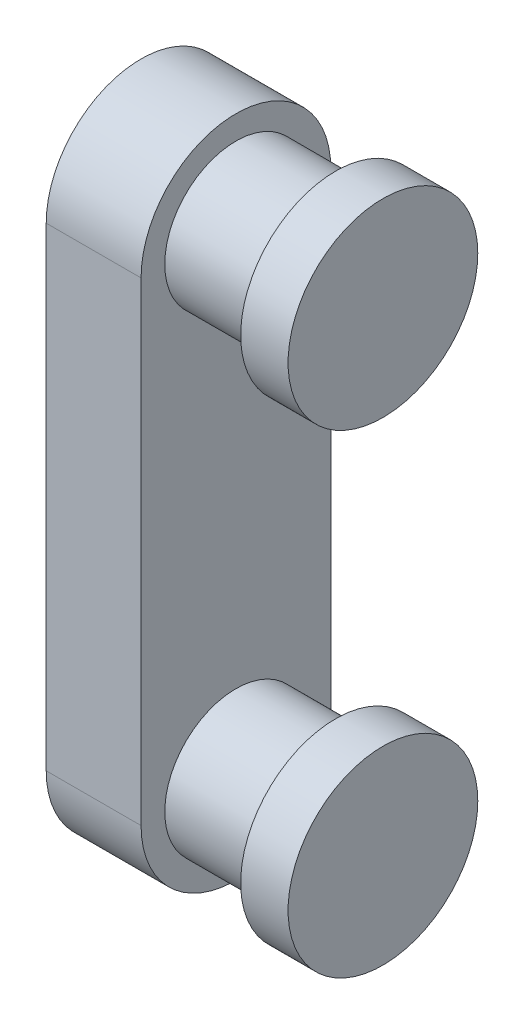
ISO-10303-21;
HEADER;
FILE_DESCRIPTION(('STEP AP214'),'2;1');
FILE_NAME('part.step','',(''),(''),'','','');
FILE_SCHEMA(('AUTOMOTIVE_DESIGN { 1 0 10303 214 1 1 1 1 }'));
ENDSEC;
DATA;
#1=APPLICATION_CONTEXT('core data for automotive mechanical design processes');
#2=APPLICATION_PROTOCOL_DEFINITION('international standard','automotive_design',2000,#1);
#3=PRODUCT_CONTEXT('',#1,'mechanical');
#4=PRODUCT('Part','Part','',(#3));
#5=PRODUCT_RELATED_PRODUCT_CATEGORY('part','',(#4));
#6=PRODUCT_DEFINITION_FORMATION('','',#4);
#7=PRODUCT_DEFINITION_CONTEXT('part definition',#1,'design');
#8=PRODUCT_DEFINITION('design','',#6,#7);
#9=PRODUCT_DEFINITION_SHAPE('','',#8);
#10=(LENGTH_UNIT() NAMED_UNIT(*) SI_UNIT(.MILLI.,.METRE.));
#11=(NAMED_UNIT(*) PLANE_ANGLE_UNIT() SI_UNIT($,.RADIAN.));
#12=(NAMED_UNIT(*) SI_UNIT($,.STERADIAN.) SOLID_ANGLE_UNIT());
#13=UNCERTAINTY_MEASURE_WITH_UNIT(LENGTH_MEASURE(1.E-05),#10,'distance_accuracy_value','');
#14=(GEOMETRIC_REPRESENTATION_CONTEXT(3) GLOBAL_UNCERTAINTY_ASSIGNED_CONTEXT((#13)) GLOBAL_UNIT_ASSIGNED_CONTEXT((#10,
#11,#12)) REPRESENTATION_CONTEXT('',''));
#15=CARTESIAN_POINT('',(0.,0.,0.));
#16=DIRECTION('',(0.,0.,1.));
#17=DIRECTION('',(1.,0.,0.));
#18=AXIS2_PLACEMENT_3D('',#15,#16,#17);
#19=CARTESIAN_POINT('',(2.,-5.,0.));
#20=DIRECTION('',(-1.,0.,0.));
#21=DIRECTION('',(0.,0.,1.));
#22=AXIS2_PLACEMENT_3D('',#19,#20,#21);
#23=PLANE('',#22);
#24=CARTESIAN_POINT('',(2.,-5.,0.));
#25=DIRECTION('',(-1.,0.,0.));
#26=DIRECTION('',(0.,0.,-1.));
#27=AXIS2_PLACEMENT_3D('',#24,#25,#26);
#28=CIRCLE('',#27,1.5);
#29=CARTESIAN_POINT('',(2.,-5.,-1.5));
#30=VERTEX_POINT('',#29);
#31=EDGE_CURVE('E167',#30,#30,#28,.T.);
#32=ORIENTED_EDGE('',*,*,#31,.T.);
#33=EDGE_LOOP('',(#32));
#34=FACE_BOUND('',#33,.T.);
#35=CARTESIAN_POINT('',(2.,-5.,0.));
#36=DIRECTION('',(1.,0.,0.));
#37=DIRECTION('',(0.,0.,1.));
#38=AXIS2_PLACEMENT_3D('',#35,#36,#37);
#39=CIRCLE('',#38,2.);
#40=CARTESIAN_POINT('',(2.,-5.,2.));
#41=VERTEX_POINT('',#40);
#42=CARTESIAN_POINT('',(2.,-5.,-2.));
#43=VERTEX_POINT('',#42);
#44=EDGE_CURVE('E86',#41,#43,#39,.T.);
#45=ORIENTED_EDGE('',*,*,#44,.T.);
#46=DIRECTION('',(0.,1.,0.));
#47=VECTOR('',#46,1.);
#48=CARTESIAN_POINT('',(2.,5.,-2.));
#49=LINE('',#48,#47);
#50=CARTESIAN_POINT('',(2.,5.,-2.));
#51=VERTEX_POINT('',#50);
#52=EDGE_CURVE('E81',#43,#51,#49,.T.);
#53=ORIENTED_EDGE('',*,*,#52,.T.);
#54=CARTESIAN_POINT('',(2.,5.,0.));
#55=DIRECTION('',(1.,0.,0.));
#56=DIRECTION('',(0.,0.,-1.));
#57=AXIS2_PLACEMENT_3D('',#54,#55,#56);
#58=CIRCLE('',#57,2.);
#59=CARTESIAN_POINT('',(2.,4.99999999999999,2.));
#60=VERTEX_POINT('',#59);
#61=EDGE_CURVE('E84',#51,#60,#58,.T.);
#62=ORIENTED_EDGE('',*,*,#61,.T.);
#63=DIRECTION('',(0.,-1.,0.));
#64=VECTOR('',#63,1.);
#65=CARTESIAN_POINT('',(2.,4.99999999999999,2.));
#66=LINE('',#65,#64);
#67=EDGE_CURVE('E50',#60,#41,#66,.T.);
#68=ORIENTED_EDGE('',*,*,#67,.T.);
#69=EDGE_LOOP('',(#45,#53,#62,#68));
#70=FACE_BOUND('',#69,.T.);
#71=CARTESIAN_POINT('',(2.,5.,0.));
#72=DIRECTION('',(-1.,0.,0.));
#73=DIRECTION('',(0.,0.,1.));
#74=AXIS2_PLACEMENT_3D('',#71,#72,#73);
#75=CIRCLE('',#74,1.5);
#76=CARTESIAN_POINT('',(2.,5.,1.5));
#77=VERTEX_POINT('',#76);
#78=EDGE_CURVE('E11',#77,#77,#75,.F.);
#79=ORIENTED_EDGE('',*,*,#78,.F.);
#80=EDGE_LOOP('',(#79));
#81=FACE_BOUND('',#80,.T.);
#82=ADVANCED_FACE('F33',(#34,#70,#81),#23,.F.);
#83=CARTESIAN_POINT('',(2.,-5.,0.));
#84=DIRECTION('',(-1.,0.,0.));
#85=DIRECTION('',(0.,0.,1.));
#86=AXIS2_PLACEMENT_3D('',#83,#84,#85);
#87=CYLINDRICAL_SURFACE('',#86,2.);
#88=CARTESIAN_POINT('',(0.,-5.,0.));
#89=DIRECTION('',(1.,0.,0.));
#90=DIRECTION('',(0.,0.,1.));
#91=AXIS2_PLACEMENT_3D('',#88,#89,#90);
#92=CIRCLE('',#91,2.);
#93=CARTESIAN_POINT('',(0.,-5.,2.));
#94=VERTEX_POINT('',#93);
#95=CARTESIAN_POINT('',(0.,-5.,-2.));
#96=VERTEX_POINT('',#95);
#97=EDGE_CURVE('E100',#94,#96,#92,.T.);
#98=ORIENTED_EDGE('',*,*,#97,.T.);
#99=DIRECTION('',(-1.,0.,0.));
#100=VECTOR('',#99,1.);
#101=CARTESIAN_POINT('',(2.,-5.,-2.));
#102=LINE('',#101,#100);
#103=EDGE_CURVE('E42',#43,#96,#102,.T.);
#104=ORIENTED_EDGE('',*,*,#103,.F.);
#105=ORIENTED_EDGE('',*,*,#44,.F.);
#106=DIRECTION('',(-1.,0.,0.));
#107=VECTOR('',#106,1.);
#108=CARTESIAN_POINT('',(2.,-5.,2.));
#109=LINE('',#108,#107);
#110=EDGE_CURVE('E96',#41,#94,#109,.T.);
#111=ORIENTED_EDGE('',*,*,#110,.T.);
#112=EDGE_LOOP('',(#98,#104,#105,#111));
#113=FACE_BOUND('',#112,.T.);
#114=ADVANCED_FACE('F35',(#113),#87,.T.);
#115=CARTESIAN_POINT('',(2.,5.,-2.));
#116=DIRECTION('',(0.,0.,1.));
#117=DIRECTION('',(0.,-1.,0.));
#118=AXIS2_PLACEMENT_3D('',#115,#116,#117);
#119=PLANE('',#118);
#120=DIRECTION('',(0.,1.,0.));
#121=VECTOR('',#120,1.);
#122=CARTESIAN_POINT('',(0.,5.,-2.));
#123=LINE('',#122,#121);
#124=CARTESIAN_POINT('',(0.,5.,-2.));
#125=VERTEX_POINT('',#124);
#126=EDGE_CURVE('E91',#96,#125,#123,.T.);
#127=ORIENTED_EDGE('',*,*,#126,.T.);
#128=DIRECTION('',(-1.,0.,0.));
#129=VECTOR('',#128,1.);
#130=CARTESIAN_POINT('',(2.,5.,-2.));
#131=LINE('',#130,#129);
#132=EDGE_CURVE('E89',#51,#125,#131,.T.);
#133=ORIENTED_EDGE('',*,*,#132,.F.);
#134=ORIENTED_EDGE('',*,*,#52,.F.);
#135=ORIENTED_EDGE('',*,*,#103,.T.);
#136=EDGE_LOOP('',(#127,#133,#134,#135));
#137=FACE_BOUND('',#136,.T.);
#138=ADVANCED_FACE('F90',(#137),#119,.F.);
#139=CARTESIAN_POINT('',(2.,5.,0.));
#140=DIRECTION('',(-1.,0.,0.));
#141=DIRECTION('',(0.,0.,1.));
#142=AXIS2_PLACEMENT_3D('',#139,#140,#141);
#143=CYLINDRICAL_SURFACE('',#142,2.);
#144=CARTESIAN_POINT('',(0.,5.,0.));
#145=DIRECTION('',(1.,0.,0.));
#146=DIRECTION('',(0.,0.,-1.));
#147=AXIS2_PLACEMENT_3D('',#144,#145,#146);
#148=CIRCLE('',#147,2.);
#149=CARTESIAN_POINT('',(0.,4.99999999999999,2.));
#150=VERTEX_POINT('',#149);
#151=EDGE_CURVE('E67',#125,#150,#148,.T.);
#152=ORIENTED_EDGE('',*,*,#151,.T.);
#153=DIRECTION('',(-1.,0.,0.));
#154=VECTOR('',#153,1.);
#155=CARTESIAN_POINT('',(2.,4.99999999999999,2.));
#156=LINE('',#155,#154);
#157=EDGE_CURVE('E92',#60,#150,#156,.T.);
#158=ORIENTED_EDGE('',*,*,#157,.F.);
#159=ORIENTED_EDGE('',*,*,#61,.F.);
#160=ORIENTED_EDGE('',*,*,#132,.T.);
#161=EDGE_LOOP('',(#152,#158,#159,#160));
#162=FACE_BOUND('',#161,.T.);
#163=ADVANCED_FACE('F94',(#162),#143,.T.);
#164=CARTESIAN_POINT('',(2.,4.99999999999999,2.));
#165=DIRECTION('',(0.,0.,-1.));
#166=DIRECTION('',(0.,1.,0.));
#167=AXIS2_PLACEMENT_3D('',#164,#165,#166);
#168=PLANE('',#167);
#169=DIRECTION('',(0.,-1.,0.));
#170=VECTOR('',#169,1.);
#171=CARTESIAN_POINT('',(0.,4.99999999999999,2.));
#172=LINE('',#171,#170);
#173=EDGE_CURVE('E73',#150,#94,#172,.T.);
#174=ORIENTED_EDGE('',*,*,#173,.T.);
#175=ORIENTED_EDGE('',*,*,#110,.F.);
#176=ORIENTED_EDGE('',*,*,#67,.F.);
#177=ORIENTED_EDGE('',*,*,#157,.T.);
#178=EDGE_LOOP('',(#174,#175,#176,#177));
#179=FACE_BOUND('',#178,.T.);
#180=ADVANCED_FACE('F114',(#179),#168,.F.);
#181=CARTESIAN_POINT('',(0.,-5.,0.));
#182=DIRECTION('',(-1.,0.,0.));
#183=DIRECTION('',(0.,0.,1.));
#184=AXIS2_PLACEMENT_3D('',#181,#182,#183);
#185=PLANE('',#184);
#186=ORIENTED_EDGE('',*,*,#97,.F.);
#187=ORIENTED_EDGE('',*,*,#173,.F.);
#188=ORIENTED_EDGE('',*,*,#151,.F.);
#189=ORIENTED_EDGE('',*,*,#126,.F.);
#190=EDGE_LOOP('',(#186,#187,#188,#189));
#191=FACE_BOUND('',#190,.T.);
#192=ADVANCED_FACE('F111',(#191),#185,.T.);
#193=CARTESIAN_POINT('',(4.1,5.,0.));
#194=DIRECTION('',(-1.,0.,0.));
#195=DIRECTION('',(0.,0.,1.));
#196=AXIS2_PLACEMENT_3D('',#193,#194,#195);
#197=CYLINDRICAL_SURFACE('',#196,1.5);
#198=CARTESIAN_POINT('',(4.1,5.,0.));
#199=DIRECTION('',(1.,0.,0.));
#200=DIRECTION('',(0.,0.,-1.));
#201=AXIS2_PLACEMENT_3D('',#198,#199,#200);
#202=CIRCLE('',#201,1.5);
#203=CARTESIAN_POINT('',(4.1,5.,-1.5));
#204=VERTEX_POINT('',#203);
#205=EDGE_CURVE('E103',#204,#204,#202,.T.);
#206=ORIENTED_EDGE('',*,*,#205,.F.);
#207=EDGE_LOOP('',(#206));
#208=FACE_BOUND('',#207,.T.);
#209=ORIENTED_EDGE('',*,*,#78,.T.);
#210=EDGE_LOOP('',(#209));
#211=FACE_BOUND('',#210,.T.);
#212=ADVANCED_FACE('F113',(#208,#211),#197,.T.);
#213=CARTESIAN_POINT('',(4.1,5.,0.));
#214=DIRECTION('',(1.,0.,0.));
#215=DIRECTION('',(0.,0.,-1.));
#216=AXIS2_PLACEMENT_3D('',#213,#214,#215);
#217=PLANE('',#216);
#218=CARTESIAN_POINT('',(4.1,5.,0.));
#219=DIRECTION('',(1.,0.,0.));
#220=DIRECTION('',(0.,0.,-1.));
#221=AXIS2_PLACEMENT_3D('',#218,#219,#220);
#222=CIRCLE('',#221,2.);
#223=CARTESIAN_POINT('',(4.1,5.,-2.));
#224=VERTEX_POINT('',#223);
#225=EDGE_CURVE('E173',#224,#224,#222,.T.);
#226=ORIENTED_EDGE('',*,*,#225,.F.);
#227=EDGE_LOOP('',(#226));
#228=FACE_BOUND('',#227,.T.);
#229=ORIENTED_EDGE('',*,*,#205,.T.);
#230=EDGE_LOOP('',(#229));
#231=FACE_BOUND('',#230,.T.);
#232=ADVANCED_FACE('F120',(#228,#231),#217,.F.);
#233=CARTESIAN_POINT('',(5.1,5.,0.));
#234=DIRECTION('',(-1.,0.,0.));
#235=DIRECTION('',(0.,0.,1.));
#236=AXIS2_PLACEMENT_3D('',#233,#234,#235);
#237=CYLINDRICAL_SURFACE('',#236,2.);
#238=CARTESIAN_POINT('',(5.1,5.,0.));
#239=DIRECTION('',(1.,0.,0.));
#240=DIRECTION('',(0.,0.,-1.));
#241=AXIS2_PLACEMENT_3D('',#238,#239,#240);
#242=CIRCLE('',#241,2.);
#243=CARTESIAN_POINT('',(5.1,5.,-2.));
#244=VERTEX_POINT('',#243);
#245=EDGE_CURVE('E174',#244,#244,#242,.T.);
#246=ORIENTED_EDGE('',*,*,#245,.F.);
#247=EDGE_LOOP('',(#246));
#248=FACE_BOUND('',#247,.T.);
#249=ORIENTED_EDGE('',*,*,#225,.T.);
#250=EDGE_LOOP('',(#249));
#251=FACE_BOUND('',#250,.T.);
#252=ADVANCED_FACE('F132',(#248,#251),#237,.T.);
#253=CARTESIAN_POINT('',(5.1,5.,0.));
#254=DIRECTION('',(1.,0.,0.));
#255=DIRECTION('',(0.,0.,-1.));
#256=AXIS2_PLACEMENT_3D('',#253,#254,#255);
#257=PLANE('',#256);
#258=ORIENTED_EDGE('',*,*,#245,.T.);
#259=EDGE_LOOP('',(#258));
#260=FACE_BOUND('',#259,.T.);
#261=ADVANCED_FACE('F135',(#260),#257,.T.);
#262=CARTESIAN_POINT('',(4.1,-5.,0.));
#263=DIRECTION('',(-1.,0.,0.));
#264=DIRECTION('',(0.,0.,1.));
#265=AXIS2_PLACEMENT_3D('',#262,#263,#264);
#266=CYLINDRICAL_SURFACE('',#265,1.5);
#267=CARTESIAN_POINT('',(4.1,-5.,0.));
#268=DIRECTION('',(1.,0.,0.));
#269=DIRECTION('',(0.,0.,-1.));
#270=AXIS2_PLACEMENT_3D('',#267,#268,#269);
#271=CIRCLE('',#270,1.5);
#272=CARTESIAN_POINT('',(4.1,-5.,-1.5));
#273=VERTEX_POINT('',#272);
#274=EDGE_CURVE('E163',#273,#273,#271,.F.);
#275=ORIENTED_EDGE('',*,*,#274,.T.);
#276=EDGE_LOOP('',(#275));
#277=FACE_BOUND('',#276,.T.);
#278=ORIENTED_EDGE('',*,*,#31,.F.);
#279=EDGE_LOOP('',(#278));
#280=FACE_BOUND('',#279,.T.);
#281=ADVANCED_FACE('F142',(#277,#280),#266,.T.);
#282=CARTESIAN_POINT('',(5.1,-5.,0.));
#283=DIRECTION('',(-1.,0.,0.));
#284=DIRECTION('',(0.,0.,1.));
#285=AXIS2_PLACEMENT_3D('',#282,#283,#284);
#286=CYLINDRICAL_SURFACE('',#285,2.);
#287=CARTESIAN_POINT('',(5.1,-5.,0.));
#288=DIRECTION('',(-1.,0.,0.));
#289=DIRECTION('',(0.,0.,-1.));
#290=AXIS2_PLACEMENT_3D('',#287,#288,#289);
#291=CIRCLE('',#290,2.);
#292=CARTESIAN_POINT('',(5.1,-5.,-2.));
#293=VERTEX_POINT('',#292);
#294=EDGE_CURVE('E162',#293,#293,#291,.T.);
#295=ORIENTED_EDGE('',*,*,#294,.T.);
#296=EDGE_LOOP('',(#295));
#297=FACE_BOUND('',#296,.T.);
#298=CARTESIAN_POINT('',(4.1,-5.,0.));
#299=DIRECTION('',(-1.,0.,0.));
#300=DIRECTION('',(0.,0.,-1.));
#301=AXIS2_PLACEMENT_3D('',#298,#299,#300);
#302=CIRCLE('',#301,2.);
#303=CARTESIAN_POINT('',(4.1,-5.,-2.));
#304=VERTEX_POINT('',#303);
#305=EDGE_CURVE('E164',#304,#304,#302,.T.);
#306=ORIENTED_EDGE('',*,*,#305,.F.);
#307=EDGE_LOOP('',(#306));
#308=FACE_BOUND('',#307,.T.);
#309=ADVANCED_FACE('F146',(#297,#308),#286,.T.);
#310=CARTESIAN_POINT('',(5.1,-5.,0.));
#311=DIRECTION('',(1.,0.,0.));
#312=DIRECTION('',(0.,0.,-1.));
#313=AXIS2_PLACEMENT_3D('',#310,#311,#312);
#314=PLANE('',#313);
#315=ORIENTED_EDGE('',*,*,#294,.F.);
#316=EDGE_LOOP('',(#315));
#317=FACE_BOUND('',#316,.T.);
#318=ADVANCED_FACE('F150',(#317),#314,.T.);
#319=CARTESIAN_POINT('',(4.1,-5.,0.));
#320=DIRECTION('',(1.,0.,0.));
#321=DIRECTION('',(0.,0.,-1.));
#322=AXIS2_PLACEMENT_3D('',#319,#320,#321);
#323=PLANE('',#322);
#324=ORIENTED_EDGE('',*,*,#274,.F.);
#325=EDGE_LOOP('',(#324));
#326=FACE_BOUND('',#325,.T.);
#327=ORIENTED_EDGE('',*,*,#305,.T.);
#328=EDGE_LOOP('',(#327));
#329=FACE_BOUND('',#328,.T.);
#330=ADVANCED_FACE('F152',(#326,#329),#323,.F.);
#331=CLOSED_SHELL('',(#82,#114,#138,#163,#180,#192,#212,#232,#252,#261,#281,#309,#318,#330));
#332=MANIFOLD_SOLID_BREP('B2',#331);
#333=ADVANCED_BREP_SHAPE_REPRESENTATION('',(#18,#332),#14);
#334=SHAPE_DEFINITION_REPRESENTATION(#9,#333);
ENDSEC;
END-ISO-10303-21;
